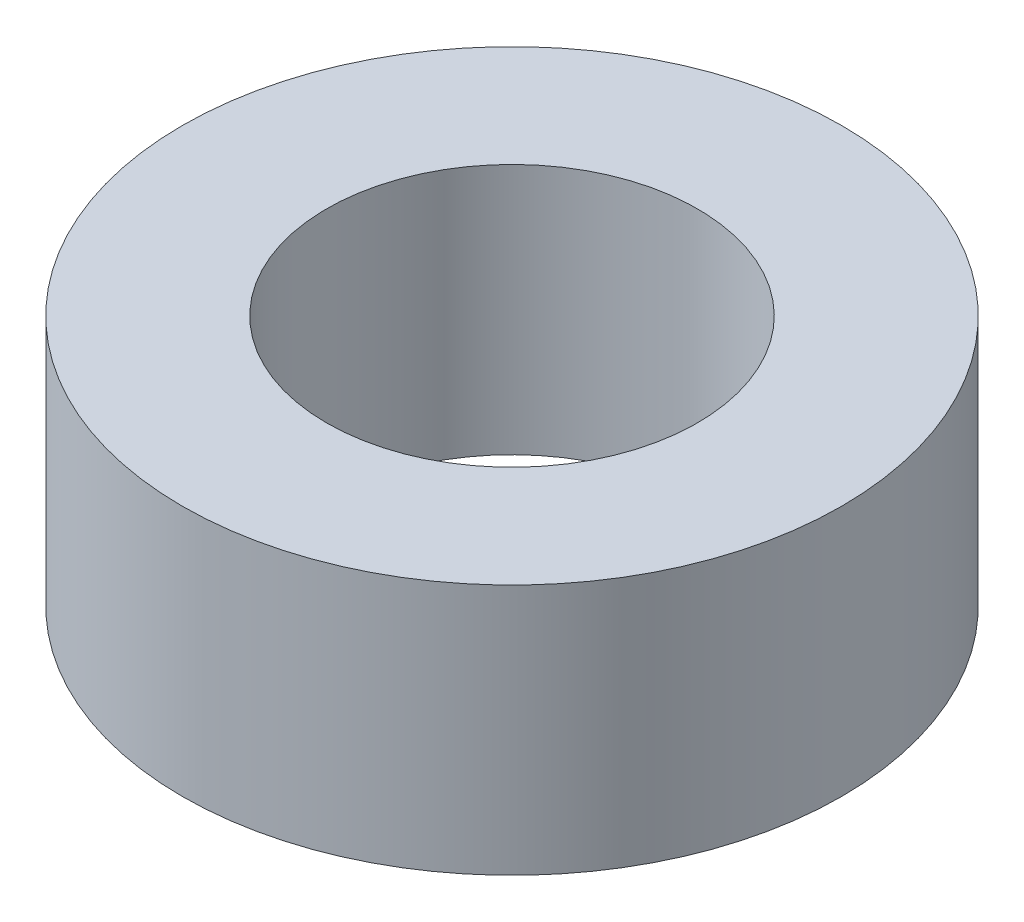
ISO-10303-21;
HEADER;
FILE_DESCRIPTION(('STEP AP214'),'2;1');
FILE_NAME('part.step','',(''),(''),'','','');
FILE_SCHEMA(('AUTOMOTIVE_DESIGN { 1 0 10303 214 1 1 1 1 }'));
ENDSEC;
DATA;
#1=APPLICATION_CONTEXT('core data for automotive mechanical design processes');
#2=APPLICATION_PROTOCOL_DEFINITION('international standard','automotive_design',2000,#1);
#3=PRODUCT_CONTEXT('',#1,'mechanical');
#4=PRODUCT('Part','Part','',(#3));
#5=PRODUCT_RELATED_PRODUCT_CATEGORY('part','',(#4));
#6=PRODUCT_DEFINITION_FORMATION('','',#4);
#7=PRODUCT_DEFINITION_CONTEXT('part definition',#1,'design');
#8=PRODUCT_DEFINITION('design','',#6,#7);
#9=PRODUCT_DEFINITION_SHAPE('','',#8);
#10=(LENGTH_UNIT() NAMED_UNIT(*) SI_UNIT(.MILLI.,.METRE.));
#11=(NAMED_UNIT(*) PLANE_ANGLE_UNIT() SI_UNIT($,.RADIAN.));
#12=(NAMED_UNIT(*) SI_UNIT($,.STERADIAN.) SOLID_ANGLE_UNIT());
#13=UNCERTAINTY_MEASURE_WITH_UNIT(LENGTH_MEASURE(1.E-05),#10,'distance_accuracy_value','');
#14=(GEOMETRIC_REPRESENTATION_CONTEXT(3) GLOBAL_UNCERTAINTY_ASSIGNED_CONTEXT((#13)) GLOBAL_UNIT_ASSIGNED_CONTEXT((#10,
#11,#12)) REPRESENTATION_CONTEXT('',''));
#15=CARTESIAN_POINT('',(0.,0.,0.));
#16=DIRECTION('',(0.,0.,1.));
#17=DIRECTION('',(1.,0.,0.));
#18=AXIS2_PLACEMENT_3D('',#15,#16,#17);
#19=CARTESIAN_POINT('',(0.,6.1,0.));
#20=DIRECTION('',(0.,1.,0.));
#21=DIRECTION('',(0.,0.,1.));
#22=AXIS2_PLACEMENT_3D('',#19,#20,#21);
#23=PLANE('',#22);
#24=CARTESIAN_POINT('',(0.,6.1,0.));
#25=DIRECTION('',(0.,1.,0.));
#26=DIRECTION('',(0.,0.,1.));
#27=AXIS2_PLACEMENT_3D('',#24,#25,#26);
#28=CIRCLE('',#27,8.);
#29=CARTESIAN_POINT('',(0.,6.1,8.));
#30=VERTEX_POINT('',#29);
#31=EDGE_CURVE('E10',#30,#30,#28,.T.);
#32=ORIENTED_EDGE('',*,*,#31,.T.);
#33=EDGE_LOOP('',(#32));
#34=FACE_BOUND('',#33,.T.);
#35=CARTESIAN_POINT('',(0.,6.1,0.));
#36=DIRECTION('',(0.,1.,0.));
#37=DIRECTION('',(0.,0.,1.));
#38=AXIS2_PLACEMENT_3D('',#35,#36,#37);
#39=CIRCLE('',#38,4.5);
#40=CARTESIAN_POINT('',(0.,6.1,4.5));
#41=VERTEX_POINT('',#40);
#42=EDGE_CURVE('E44',#41,#41,#39,.T.);
#43=ORIENTED_EDGE('',*,*,#42,.F.);
#44=EDGE_LOOP('',(#43));
#45=FACE_BOUND('',#44,.T.);
#46=ADVANCED_FACE('F33',(#34,#45),#23,.T.);
#47=CARTESIAN_POINT('',(0.,0.,0.));
#48=DIRECTION('',(0.,1.,0.));
#49=DIRECTION('',(0.,0.,1.));
#50=AXIS2_PLACEMENT_3D('',#47,#48,#49);
#51=PLANE('',#50);
#52=CARTESIAN_POINT('',(0.,0.,0.));
#53=DIRECTION('',(0.,1.,0.));
#54=DIRECTION('',(0.,0.,1.));
#55=AXIS2_PLACEMENT_3D('',#52,#53,#54);
#56=CIRCLE('',#55,8.);
#57=CARTESIAN_POINT('',(0.,0.,8.));
#58=VERTEX_POINT('',#57);
#59=EDGE_CURVE('E37',#58,#58,#56,.T.);
#60=ORIENTED_EDGE('',*,*,#59,.F.);
#61=EDGE_LOOP('',(#60));
#62=FACE_BOUND('',#61,.T.);
#63=CARTESIAN_POINT('',(0.,0.,0.));
#64=DIRECTION('',(0.,1.,0.));
#65=DIRECTION('',(0.,0.,1.));
#66=AXIS2_PLACEMENT_3D('',#63,#64,#65);
#67=CIRCLE('',#66,4.5);
#68=CARTESIAN_POINT('',(0.,0.,4.5));
#69=VERTEX_POINT('',#68);
#70=EDGE_CURVE('E46',#69,#69,#67,.T.);
#71=ORIENTED_EDGE('',*,*,#70,.T.);
#72=EDGE_LOOP('',(#71));
#73=FACE_BOUND('',#72,.T.);
#74=ADVANCED_FACE('F56',(#62,#73),#51,.F.);
#75=CARTESIAN_POINT('',(0.,6.1,0.));
#76=DIRECTION('',(0.,-1.,0.));
#77=DIRECTION('',(0.,0.,-1.));
#78=AXIS2_PLACEMENT_3D('',#75,#76,#77);
#79=CYLINDRICAL_SURFACE('',#78,8.);
#80=ORIENTED_EDGE('',*,*,#31,.F.);
#81=EDGE_LOOP('',(#80));
#82=FACE_BOUND('',#81,.T.);
#83=ORIENTED_EDGE('',*,*,#59,.T.);
#84=EDGE_LOOP('',(#83));
#85=FACE_BOUND('',#84,.T.);
#86=ADVANCED_FACE('F35',(#82,#85),#79,.T.);
#87=CARTESIAN_POINT('',(0.,6.1,0.));
#88=DIRECTION('',(0.,-1.,0.));
#89=DIRECTION('',(0.,0.,-1.));
#90=AXIS2_PLACEMENT_3D('',#87,#88,#89);
#91=CYLINDRICAL_SURFACE('',#90,4.5);
#92=ORIENTED_EDGE('',*,*,#42,.T.);
#93=EDGE_LOOP('',(#92));
#94=FACE_BOUND('',#93,.T.);
#95=ORIENTED_EDGE('',*,*,#70,.F.);
#96=EDGE_LOOP('',(#95));
#97=FACE_BOUND('',#96,.T.);
#98=ADVANCED_FACE('F52',(#94,#97),#91,.F.);
#99=CLOSED_SHELL('',(#46,#74,#86,#98));
#100=MANIFOLD_SOLID_BREP('B2',#99);
#101=ADVANCED_BREP_SHAPE_REPRESENTATION('',(#18,#100),#14);
#102=SHAPE_DEFINITION_REPRESENTATION(#9,#101);
ENDSEC;
END-ISO-10303-21;
